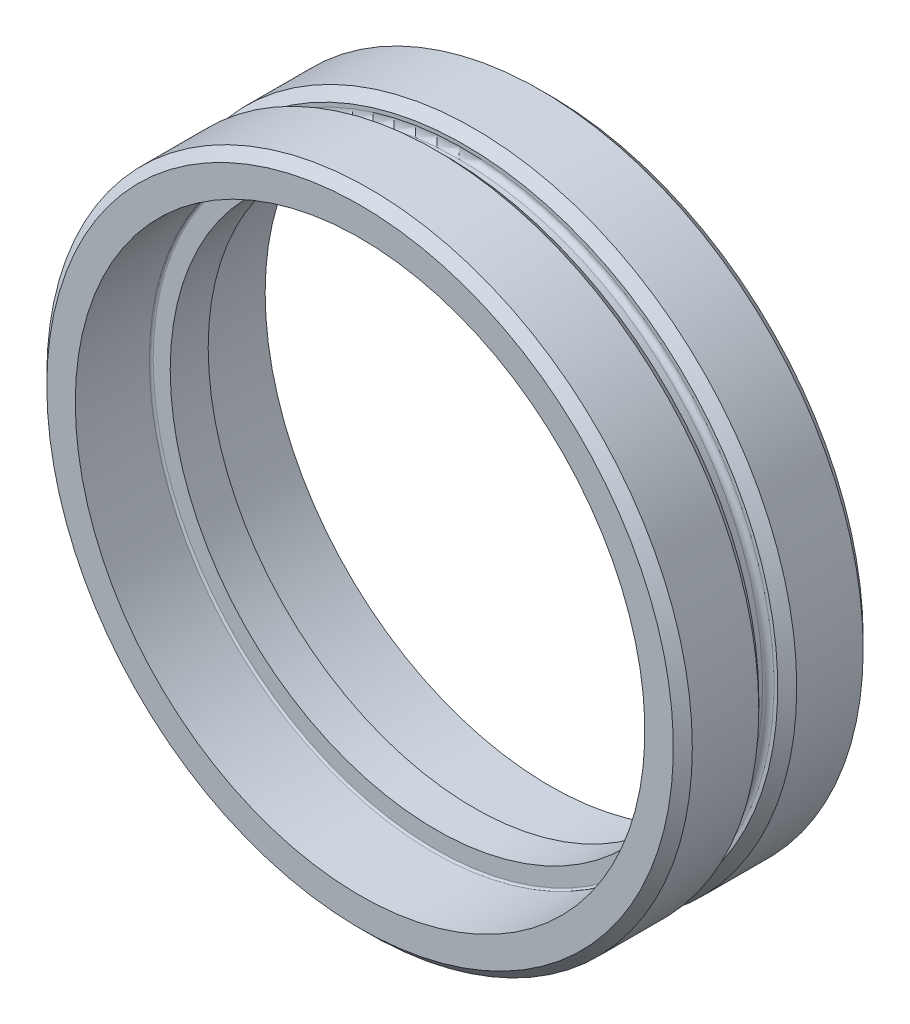
ISO-10303-21;
HEADER;
FILE_DESCRIPTION(('STEP AP214'),'2;1');
FILE_NAME('part.step','',(''),(''),'','','');
FILE_SCHEMA(('AUTOMOTIVE_DESIGN { 1 0 10303 214 1 1 1 1 }'));
ENDSEC;
DATA;
#1=APPLICATION_CONTEXT('core data for automotive mechanical design processes');
#2=APPLICATION_PROTOCOL_DEFINITION('international standard','automotive_design',2000,#1);
#3=PRODUCT_CONTEXT('',#1,'mechanical');
#4=PRODUCT('Part','Part','',(#3));
#5=PRODUCT_RELATED_PRODUCT_CATEGORY('part','',(#4));
#6=PRODUCT_DEFINITION_FORMATION('','',#4);
#7=PRODUCT_DEFINITION_CONTEXT('part definition',#1,'design');
#8=PRODUCT_DEFINITION('design','',#6,#7);
#9=PRODUCT_DEFINITION_SHAPE('','',#8);
#10=(LENGTH_UNIT() NAMED_UNIT(*) SI_UNIT(.MILLI.,.METRE.));
#11=(NAMED_UNIT(*) PLANE_ANGLE_UNIT() SI_UNIT($,.RADIAN.));
#12=(NAMED_UNIT(*) SI_UNIT($,.STERADIAN.) SOLID_ANGLE_UNIT());
#13=UNCERTAINTY_MEASURE_WITH_UNIT(LENGTH_MEASURE(1.E-05),#10,'distance_accuracy_value','');
#14=(GEOMETRIC_REPRESENTATION_CONTEXT(3) GLOBAL_UNCERTAINTY_ASSIGNED_CONTEXT((#13)) GLOBAL_UNIT_ASSIGNED_CONTEXT((#10,
#11,#12)) REPRESENTATION_CONTEXT('',''));
#15=CARTESIAN_POINT('',(0.,0.,0.));
#16=DIRECTION('',(0.,0.,1.));
#17=DIRECTION('',(1.,0.,0.));
#18=AXIS2_PLACEMENT_3D('',#15,#16,#17);
#19=CARTESIAN_POINT('',(0.,0.,0.));
#20=DIRECTION('',(0.,0.,-1.));
#21=DIRECTION('',(-1.,0.,0.));
#22=AXIS2_PLACEMENT_3D('',#19,#20,#21);
#23=CYLINDRICAL_SURFACE('',#22,17.);
#24=CARTESIAN_POINT('',(0.,0.,9.5));
#25=DIRECTION('',(0.,0.,-1.));
#26=DIRECTION('',(-1.,0.,0.));
#27=AXIS2_PLACEMENT_3D('',#24,#25,#26);
#28=CIRCLE('',#27,17.);
#29=CARTESIAN_POINT('',(-17.,0.,9.5));
#30=VERTEX_POINT('',#29);
#31=EDGE_CURVE('E59',#30,#30,#28,.T.);
#32=ORIENTED_EDGE('',*,*,#31,.T.);
#33=EDGE_LOOP('',(#32));
#34=FACE_BOUND('',#33,.T.);
#35=CARTESIAN_POINT('',(0.,0.,6.00000000000001));
#36=DIRECTION('',(0.,0.,1.));
#37=DIRECTION('',(1.,0.,0.));
#38=AXIS2_PLACEMENT_3D('',#35,#36,#37);
#39=CIRCLE('',#38,17.);
#40=CARTESIAN_POINT('',(17.,0.,6.00000000000001));
#41=VERTEX_POINT('',#40);
#42=EDGE_CURVE('E62',#41,#41,#39,.T.);
#43=ORIENTED_EDGE('',*,*,#42,.T.);
#44=EDGE_LOOP('',(#43));
#45=FACE_BOUND('',#44,.T.);
#46=ADVANCED_FACE('F33',(#34,#45),#23,.T.);
#47=CARTESIAN_POINT('',(0.,-17.,10.));
#48=DIRECTION('',(0.,0.,-1.));
#49=DIRECTION('',(-1.,0.,0.));
#50=AXIS2_PLACEMENT_3D('',#47,#48,#49);
#51=PLANE('',#50);
#52=CARTESIAN_POINT('',(0.,0.,10.));
#53=DIRECTION('',(0.,0.,-1.));
#54=DIRECTION('',(-1.,0.,0.));
#55=AXIS2_PLACEMENT_3D('',#52,#53,#54);
#56=CIRCLE('',#55,16.5);
#57=CARTESIAN_POINT('',(-16.5,0.,10.));
#58=VERTEX_POINT('',#57);
#59=EDGE_CURVE('E56',#58,#58,#56,.F.);
#60=ORIENTED_EDGE('',*,*,#59,.T.);
#61=EDGE_LOOP('',(#60));
#62=FACE_BOUND('',#61,.T.);
#63=CARTESIAN_POINT('',(0.,0.,10.));
#64=DIRECTION('',(0.,0.,-1.));
#65=DIRECTION('',(-1.,0.,0.));
#66=AXIS2_PLACEMENT_3D('',#63,#64,#65);
#67=CIRCLE('',#66,15.);
#68=CARTESIAN_POINT('',(-15.,0.,10.));
#69=VERTEX_POINT('',#68);
#70=EDGE_CURVE('E89',#69,#69,#67,.T.);
#71=ORIENTED_EDGE('',*,*,#70,.T.);
#72=EDGE_LOOP('',(#71));
#73=FACE_BOUND('',#72,.T.);
#74=ADVANCED_FACE('F119',(#62,#73),#51,.F.);
#75=CARTESIAN_POINT('',(0.,0.,0.));
#76=DIRECTION('',(0.,0.,-1.));
#77=DIRECTION('',(-1.,0.,0.));
#78=AXIS2_PLACEMENT_3D('',#75,#76,#77);
#79=CYLINDRICAL_SURFACE('',#78,15.);
#80=CARTESIAN_POINT('',(0.,0.,6.1));
#81=DIRECTION('',(0.,0.,-1.));
#82=DIRECTION('',(-1.,0.,0.));
#83=AXIS2_PLACEMENT_3D('',#80,#81,#82);
#84=CIRCLE('',#83,15.);
#85=CARTESIAN_POINT('',(-15.,0.,6.1));
#86=VERTEX_POINT('',#85);
#87=EDGE_CURVE('E48',#86,#86,#84,.T.);
#88=ORIENTED_EDGE('',*,*,#87,.T.);
#89=EDGE_LOOP('',(#88));
#90=FACE_BOUND('',#89,.T.);
#91=ORIENTED_EDGE('',*,*,#70,.F.);
#92=EDGE_LOOP('',(#91));
#93=FACE_BOUND('',#92,.T.);
#94=ADVANCED_FACE('F125',(#90,#93),#79,.F.);
#95=CARTESIAN_POINT('',(0.,-15.,6.));
#96=DIRECTION('',(0.,0.,-1.));
#97=DIRECTION('',(-1.,0.,0.));
#98=AXIS2_PLACEMENT_3D('',#95,#96,#97);
#99=PLANE('',#98);
#100=CARTESIAN_POINT('',(0.,0.,6.));
#101=DIRECTION('',(0.,0.,-1.));
#102=DIRECTION('',(-1.,0.,0.));
#103=AXIS2_PLACEMENT_3D('',#100,#101,#102);
#104=CIRCLE('',#103,14.9);
#105=CARTESIAN_POINT('',(-14.9,0.,6.));
#106=VERTEX_POINT('',#105);
#107=EDGE_CURVE('E44',#106,#106,#104,.F.);
#108=ORIENTED_EDGE('',*,*,#107,.T.);
#109=EDGE_LOOP('',(#108));
#110=FACE_BOUND('',#109,.T.);
#111=CARTESIAN_POINT('',(0.,0.,6.));
#112=DIRECTION('',(0.,0.,-1.));
#113=DIRECTION('',(-1.,0.,0.));
#114=AXIS2_PLACEMENT_3D('',#111,#112,#113);
#115=CIRCLE('',#114,14.);
#116=CARTESIAN_POINT('',(-14.,0.,6.));
#117=VERTEX_POINT('',#116);
#118=EDGE_CURVE('E92',#117,#117,#115,.T.);
#119=ORIENTED_EDGE('',*,*,#118,.T.);
#120=EDGE_LOOP('',(#119));
#121=FACE_BOUND('',#120,.T.);
#122=ADVANCED_FACE('F168',(#110,#121),#99,.F.);
#123=CARTESIAN_POINT('',(0.,0.,0.));
#124=DIRECTION('',(0.,0.,-1.));
#125=DIRECTION('',(-1.,0.,0.));
#126=AXIS2_PLACEMENT_3D('',#123,#124,#125);
#127=CYLINDRICAL_SURFACE('',#126,14.);
#128=ORIENTED_EDGE('',*,*,#118,.F.);
#129=EDGE_LOOP('',(#128));
#130=FACE_BOUND('',#129,.T.);
#131=CARTESIAN_POINT('',(0.,0.,4.));
#132=DIRECTION('',(0.,0.,-1.));
#133=DIRECTION('',(-1.,0.,0.));
#134=AXIS2_PLACEMENT_3D('',#131,#132,#133);
#135=CIRCLE('',#134,14.);
#136=CARTESIAN_POINT('',(-14.,0.,4.));
#137=VERTEX_POINT('',#136);
#138=EDGE_CURVE('E95',#137,#137,#135,.T.);
#139=ORIENTED_EDGE('',*,*,#138,.T.);
#140=EDGE_LOOP('',(#139));
#141=FACE_BOUND('',#140,.T.);
#142=ADVANCED_FACE('F174',(#130,#141),#127,.F.);
#143=CARTESIAN_POINT('',(0.,-14.,4.));
#144=DIRECTION('',(0.,0.,1.));
#145=DIRECTION('',(1.,0.,0.));
#146=AXIS2_PLACEMENT_3D('',#143,#144,#145);
#147=PLANE('',#146);
#148=CARTESIAN_POINT('',(0.,0.,4.));
#149=DIRECTION('',(0.,0.,1.));
#150=DIRECTION('',(1.,0.,0.));
#151=AXIS2_PLACEMENT_3D('',#148,#149,#150);
#152=CIRCLE('',#151,14.9);
#153=CARTESIAN_POINT('',(14.9,0.,4.));
#154=VERTEX_POINT('',#153);
#155=EDGE_CURVE('E40',#154,#154,#152,.F.);
#156=ORIENTED_EDGE('',*,*,#155,.T.);
#157=EDGE_LOOP('',(#156));
#158=FACE_BOUND('',#157,.T.);
#159=ORIENTED_EDGE('',*,*,#138,.F.);
#160=EDGE_LOOP('',(#159));
#161=FACE_BOUND('',#160,.T.);
#162=ADVANCED_FACE('F116',(#158,#161),#147,.F.);
#163=CARTESIAN_POINT('',(0.,0.,0.));
#164=DIRECTION('',(0.,0.,-1.));
#165=DIRECTION('',(-1.,0.,0.));
#166=AXIS2_PLACEMENT_3D('',#163,#164,#165);
#167=CYLINDRICAL_SURFACE('',#166,15.);
#168=CARTESIAN_POINT('',(0.,0.,3.9));
#169=DIRECTION('',(0.,0.,1.));
#170=DIRECTION('',(1.,0.,0.));
#171=AXIS2_PLACEMENT_3D('',#168,#169,#170);
#172=CIRCLE('',#171,15.);
#173=CARTESIAN_POINT('',(15.,0.,3.9));
#174=VERTEX_POINT('',#173);
#175=EDGE_CURVE('E10',#174,#174,#172,.T.);
#176=ORIENTED_EDGE('',*,*,#175,.T.);
#177=EDGE_LOOP('',(#176));
#178=FACE_BOUND('',#177,.T.);
#179=CARTESIAN_POINT('',(0.,0.,0.));
#180=DIRECTION('',(0.,0.,-1.));
#181=DIRECTION('',(-1.,0.,0.));
#182=AXIS2_PLACEMENT_3D('',#179,#180,#181);
#183=CIRCLE('',#182,15.);
#184=CARTESIAN_POINT('',(-15.,0.,0.));
#185=VERTEX_POINT('',#184);
#186=EDGE_CURVE('E98',#185,#185,#183,.T.);
#187=ORIENTED_EDGE('',*,*,#186,.T.);
#188=EDGE_LOOP('',(#187));
#189=FACE_BOUND('',#188,.T.);
#190=ADVANCED_FACE('F102',(#178,#189),#167,.F.);
#191=CARTESIAN_POINT('',(0.,-17.,0.));
#192=DIRECTION('',(0.,0.,1.));
#193=DIRECTION('',(1.,0.,0.));
#194=AXIS2_PLACEMENT_3D('',#191,#192,#193);
#195=PLANE('',#194);
#196=CARTESIAN_POINT('',(0.,0.,0.));
#197=DIRECTION('',(0.,0.,1.));
#198=DIRECTION('',(1.,0.,0.));
#199=AXIS2_PLACEMENT_3D('',#196,#197,#198);
#200=CIRCLE('',#199,16.5);
#201=CARTESIAN_POINT('',(16.5,0.,0.));
#202=VERTEX_POINT('',#201);
#203=EDGE_CURVE('E65',#202,#202,#200,.F.);
#204=ORIENTED_EDGE('',*,*,#203,.T.);
#205=EDGE_LOOP('',(#204));
#206=FACE_BOUND('',#205,.T.);
#207=ORIENTED_EDGE('',*,*,#186,.F.);
#208=EDGE_LOOP('',(#207));
#209=FACE_BOUND('',#208,.T.);
#210=ADVANCED_FACE('F104',(#206,#209),#195,.F.);
#211=CARTESIAN_POINT('',(0.,0.,0.));
#212=DIRECTION('',(0.,0.,-1.));
#213=DIRECTION('',(-1.,0.,0.));
#214=AXIS2_PLACEMENT_3D('',#211,#212,#213);
#215=CYLINDRICAL_SURFACE('',#214,17.);
#216=CARTESIAN_POINT('',(0.,0.,3.99999999999999));
#217=DIRECTION('',(0.,0.,-1.));
#218=DIRECTION('',(-1.,0.,0.));
#219=AXIS2_PLACEMENT_3D('',#216,#217,#218);
#220=CIRCLE('',#219,17.);
#221=CARTESIAN_POINT('',(-17.,0.,3.99999999999999));
#222=VERTEX_POINT('',#221);
#223=EDGE_CURVE('E71',#222,#222,#220,.T.);
#224=ORIENTED_EDGE('',*,*,#223,.T.);
#225=EDGE_LOOP('',(#224));
#226=FACE_BOUND('',#225,.T.);
#227=CARTESIAN_POINT('',(0.,0.,0.5));
#228=DIRECTION('',(0.,0.,1.));
#229=DIRECTION('',(1.,0.,0.));
#230=AXIS2_PLACEMENT_3D('',#227,#228,#229);
#231=CIRCLE('',#230,17.);
#232=CARTESIAN_POINT('',(17.,0.,0.5));
#233=VERTEX_POINT('',#232);
#234=EDGE_CURVE('E74',#233,#233,#231,.T.);
#235=ORIENTED_EDGE('',*,*,#234,.T.);
#236=EDGE_LOOP('',(#235));
#237=FACE_BOUND('',#236,.T.);
#238=ADVANCED_FACE('F106',(#226,#237),#215,.T.);
#239=CARTESIAN_POINT('',(0.,-17.,4.5));
#240=DIRECTION('',(0.,0.,-1.));
#241=DIRECTION('',(-1.,0.,0.));
#242=AXIS2_PLACEMENT_3D('',#239,#240,#241);
#243=PLANE('',#242);
#244=CARTESIAN_POINT('',(0.,0.,4.5));
#245=DIRECTION('',(0.,0.,-1.));
#246=DIRECTION('',(-1.,0.,0.));
#247=AXIS2_PLACEMENT_3D('',#244,#245,#246);
#248=CIRCLE('',#247,16.5);
#249=CARTESIAN_POINT('',(-16.5,0.,4.5));
#250=VERTEX_POINT('',#249);
#251=EDGE_CURVE('E68',#250,#250,#248,.F.);
#252=ORIENTED_EDGE('',*,*,#251,.T.);
#253=EDGE_LOOP('',(#252));
#254=FACE_BOUND('',#253,.T.);
#255=CARTESIAN_POINT('',(0.,0.,4.5));
#256=DIRECTION('',(0.,0.,-1.));
#257=DIRECTION('',(-1.,0.,0.));
#258=AXIS2_PLACEMENT_3D('',#255,#256,#257);
#259=CIRCLE('',#258,16.3);
#260=CARTESIAN_POINT('',(-16.3,0.,4.5));
#261=VERTEX_POINT('',#260);
#262=EDGE_CURVE('E86',#261,#261,#259,.T.);
#263=ORIENTED_EDGE('',*,*,#262,.T.);
#264=EDGE_LOOP('',(#263));
#265=FACE_BOUND('',#264,.T.);
#266=ADVANCED_FACE('F113',(#254,#265),#243,.F.);
#267=CARTESIAN_POINT('',(0.,0.,0.));
#268=DIRECTION('',(0.,0.,-1.));
#269=DIRECTION('',(-1.,0.,0.));
#270=AXIS2_PLACEMENT_3D('',#267,#268,#269);
#271=CYLINDRICAL_SURFACE('',#270,16.);
#272=CARTESIAN_POINT('',(0.,0.,4.8));
#273=DIRECTION('',(0.,0.,-1.));
#274=DIRECTION('',(-1.,0.,0.));
#275=AXIS2_PLACEMENT_3D('',#272,#273,#274);
#276=CIRCLE('',#275,16.);
#277=CARTESIAN_POINT('',(-16.,0.,4.8));
#278=VERTEX_POINT('',#277);
#279=EDGE_CURVE('E80',#278,#278,#276,.F.);
#280=ORIENTED_EDGE('',*,*,#279,.T.);
#281=EDGE_LOOP('',(#280));
#282=FACE_BOUND('',#281,.T.);
#283=CARTESIAN_POINT('',(0.,0.,5.2));
#284=DIRECTION('',(0.,0.,1.));
#285=DIRECTION('',(1.,0.,0.));
#286=AXIS2_PLACEMENT_3D('',#283,#284,#285);
#287=CIRCLE('',#286,16.);
#288=CARTESIAN_POINT('',(16.,0.,5.2));
#289=VERTEX_POINT('',#288);
#290=EDGE_CURVE('E83',#289,#289,#287,.F.);
#291=ORIENTED_EDGE('',*,*,#290,.T.);
#292=EDGE_LOOP('',(#291));
#293=FACE_BOUND('',#292,.T.);
#294=ADVANCED_FACE('F246',(#282,#293),#271,.T.);
#295=CARTESIAN_POINT('',(0.,-16.,5.5));
#296=DIRECTION('',(0.,0.,1.));
#297=DIRECTION('',(1.,0.,0.));
#298=AXIS2_PLACEMENT_3D('',#295,#296,#297);
#299=PLANE('',#298);
#300=CARTESIAN_POINT('',(0.,0.,5.5));
#301=DIRECTION('',(0.,0.,1.));
#302=DIRECTION('',(1.,0.,0.));
#303=AXIS2_PLACEMENT_3D('',#300,#301,#302);
#304=CIRCLE('',#303,16.5);
#305=CARTESIAN_POINT('',(16.5,0.,5.5));
#306=VERTEX_POINT('',#305);
#307=EDGE_CURVE('E53',#306,#306,#304,.F.);
#308=ORIENTED_EDGE('',*,*,#307,.T.);
#309=EDGE_LOOP('',(#308));
#310=FACE_BOUND('',#309,.T.);
#311=CARTESIAN_POINT('',(0.,0.,5.5));
#312=DIRECTION('',(0.,0.,1.));
#313=DIRECTION('',(1.,0.,0.));
#314=AXIS2_PLACEMENT_3D('',#311,#312,#313);
#315=CIRCLE('',#314,16.3);
#316=CARTESIAN_POINT('',(16.3,0.,5.5));
#317=VERTEX_POINT('',#316);
#318=EDGE_CURVE('E77',#317,#317,#315,.T.);
#319=ORIENTED_EDGE('',*,*,#318,.T.);
#320=EDGE_LOOP('',(#319));
#321=FACE_BOUND('',#320,.T.);
#322=ADVANCED_FACE('F135',(#310,#321),#299,.F.);
#323=CARTESIAN_POINT('',(0.,0.,4.8));
#324=DIRECTION('',(0.,0.,-1.));
#325=DIRECTION('',(-1.,0.,0.));
#326=AXIS2_PLACEMENT_3D('',#323,#324,#325);
#327=TOROIDAL_SURFACE('',#326,16.3,0.3);
#328=ORIENTED_EDGE('',*,*,#279,.F.);
#329=EDGE_LOOP('',(#328));
#330=FACE_BOUND('',#329,.T.);
#331=ORIENTED_EDGE('',*,*,#262,.F.);
#332=EDGE_LOOP('',(#331));
#333=FACE_BOUND('',#332,.T.);
#334=ADVANCED_FACE('F131',(#330,#333),#327,.F.);
#335=CARTESIAN_POINT('',(0.,0.,5.2));
#336=DIRECTION('',(0.,0.,1.));
#337=DIRECTION('',(1.,0.,0.));
#338=AXIS2_PLACEMENT_3D('',#335,#336,#337);
#339=TOROIDAL_SURFACE('',#338,16.3,0.3);
#340=ORIENTED_EDGE('',*,*,#318,.F.);
#341=EDGE_LOOP('',(#340));
#342=FACE_BOUND('',#341,.T.);
#343=ORIENTED_EDGE('',*,*,#290,.F.);
#344=EDGE_LOOP('',(#343));
#345=FACE_BOUND('',#344,.T.);
#346=ADVANCED_FACE('F134',(#342,#345),#339,.F.);
#347=CARTESIAN_POINT('',(0.,0.,3.99999999999999));
#348=DIRECTION('',(0.,0.,-1.));
#349=DIRECTION('',(-1.,0.,0.));
#350=AXIS2_PLACEMENT_3D('',#347,#348,#349);
#351=CONICAL_SURFACE('',#350,17.,0.785398163397452);
#352=ORIENTED_EDGE('',*,*,#251,.F.);
#353=EDGE_LOOP('',(#352));
#354=FACE_BOUND('',#353,.T.);
#355=ORIENTED_EDGE('',*,*,#223,.F.);
#356=EDGE_LOOP('',(#355));
#357=FACE_BOUND('',#356,.T.);
#358=ADVANCED_FACE('F139',(#354,#357),#351,.T.);
#359=CARTESIAN_POINT('',(0.,0.,0.));
#360=DIRECTION('',(0.,0.,1.));
#361=DIRECTION('',(1.,0.,0.));
#362=AXIS2_PLACEMENT_3D('',#359,#360,#361);
#363=CONICAL_SURFACE('',#362,16.5,0.785398163397448);
#364=ORIENTED_EDGE('',*,*,#234,.F.);
#365=EDGE_LOOP('',(#364));
#366=FACE_BOUND('',#365,.T.);
#367=ORIENTED_EDGE('',*,*,#203,.F.);
#368=EDGE_LOOP('',(#367));
#369=FACE_BOUND('',#368,.T.);
#370=ADVANCED_FACE('F143',(#366,#369),#363,.T.);
#371=CARTESIAN_POINT('',(0.,0.,9.5));
#372=DIRECTION('',(0.,0.,-1.));
#373=DIRECTION('',(-1.,0.,0.));
#374=AXIS2_PLACEMENT_3D('',#371,#372,#373);
#375=CONICAL_SURFACE('',#374,17.,0.785398163397445);
#376=ORIENTED_EDGE('',*,*,#59,.F.);
#377=EDGE_LOOP('',(#376));
#378=FACE_BOUND('',#377,.T.);
#379=ORIENTED_EDGE('',*,*,#31,.F.);
#380=EDGE_LOOP('',(#379));
#381=FACE_BOUND('',#380,.T.);
#382=ADVANCED_FACE('F147',(#378,#381),#375,.T.);
#383=CARTESIAN_POINT('',(0.,0.,5.5));
#384=DIRECTION('',(0.,0.,1.));
#385=DIRECTION('',(1.,0.,0.));
#386=AXIS2_PLACEMENT_3D('',#383,#384,#385);
#387=CONICAL_SURFACE('',#386,16.5,0.785398163397448);
#388=ORIENTED_EDGE('',*,*,#42,.F.);
#389=EDGE_LOOP('',(#388));
#390=FACE_BOUND('',#389,.T.);
#391=ORIENTED_EDGE('',*,*,#307,.F.);
#392=EDGE_LOOP('',(#391));
#393=FACE_BOUND('',#392,.T.);
#394=ADVANCED_FACE('F151',(#390,#393),#387,.T.);
#395=CARTESIAN_POINT('',(0.,0.,6.1));
#396=DIRECTION('',(0.,0.,-1.));
#397=DIRECTION('',(-1.,0.,0.));
#398=AXIS2_PLACEMENT_3D('',#395,#396,#397);
#399=TOROIDAL_SURFACE('',#398,14.9,0.1);
#400=ORIENTED_EDGE('',*,*,#107,.F.);
#401=EDGE_LOOP('',(#400));
#402=FACE_BOUND('',#401,.T.);
#403=ORIENTED_EDGE('',*,*,#87,.F.);
#404=EDGE_LOOP('',(#403));
#405=FACE_BOUND('',#404,.T.);
#406=ADVANCED_FACE('F154',(#402,#405),#399,.F.);
#407=CARTESIAN_POINT('',(0.,0.,3.9));
#408=DIRECTION('',(0.,0.,1.));
#409=DIRECTION('',(1.,0.,0.));
#410=AXIS2_PLACEMENT_3D('',#407,#408,#409);
#411=TOROIDAL_SURFACE('',#410,14.9,0.1);
#412=ORIENTED_EDGE('',*,*,#175,.F.);
#413=EDGE_LOOP('',(#412));
#414=FACE_BOUND('',#413,.T.);
#415=ORIENTED_EDGE('',*,*,#155,.F.);
#416=EDGE_LOOP('',(#415));
#417=FACE_BOUND('',#416,.T.);
#418=ADVANCED_FACE('F35',(#414,#417),#411,.F.);
#419=CLOSED_SHELL('',(#46,#74,#94,#122,#142,#162,#190,#210,#238,#266,#294,#322,#334,#346,#358,
#370,#382,#394,#406,#418));
#420=MANIFOLD_SOLID_BREP('B2',#419);
#421=ADVANCED_BREP_SHAPE_REPRESENTATION('',(#18,#420),#14);
#422=SHAPE_DEFINITION_REPRESENTATION(#9,#421);
ENDSEC;
END-ISO-10303-21;
